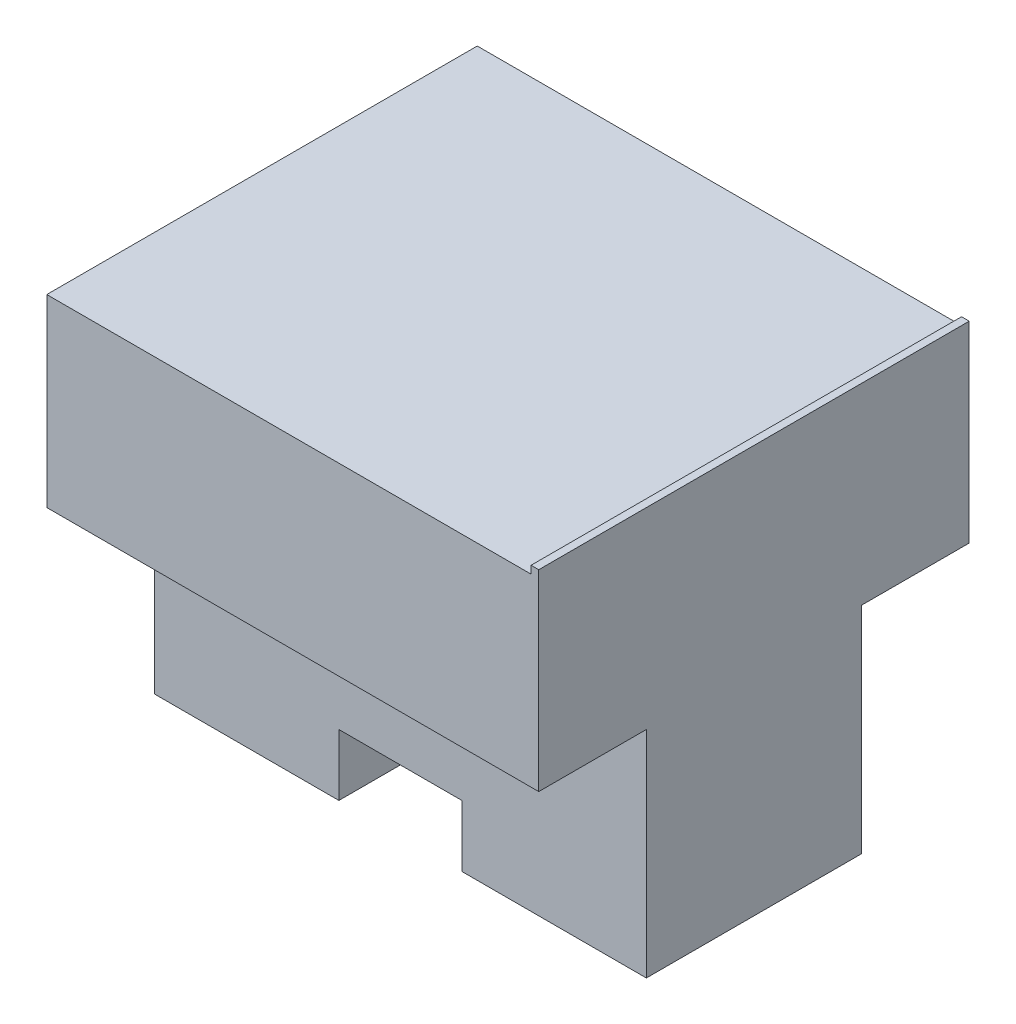
ISO-10303-21;
HEADER;
FILE_DESCRIPTION(('STEP AP214'),'2;1');
FILE_NAME('part.step','',(''),(''),'','','');
FILE_SCHEMA(('AUTOMOTIVE_DESIGN { 1 0 10303 214 1 1 1 1 }'));
ENDSEC;
DATA;
#1=APPLICATION_CONTEXT('core data for automotive mechanical design processes');
#2=APPLICATION_PROTOCOL_DEFINITION('international standard','automotive_design',2000,#1);
#3=PRODUCT_CONTEXT('',#1,'mechanical');
#4=PRODUCT('Part','Part','',(#3));
#5=PRODUCT_RELATED_PRODUCT_CATEGORY('part','',(#4));
#6=PRODUCT_DEFINITION_FORMATION('','',#4);
#7=PRODUCT_DEFINITION_CONTEXT('part definition',#1,'design');
#8=PRODUCT_DEFINITION('design','',#6,#7);
#9=PRODUCT_DEFINITION_SHAPE('','',#8);
#10=(LENGTH_UNIT() NAMED_UNIT(*) SI_UNIT(.MILLI.,.METRE.));
#11=(NAMED_UNIT(*) PLANE_ANGLE_UNIT() SI_UNIT($,.RADIAN.));
#12=(NAMED_UNIT(*) SI_UNIT($,.STERADIAN.) SOLID_ANGLE_UNIT());
#13=UNCERTAINTY_MEASURE_WITH_UNIT(LENGTH_MEASURE(1.E-05),#10,'distance_accuracy_value','');
#14=(GEOMETRIC_REPRESENTATION_CONTEXT(3) GLOBAL_UNCERTAINTY_ASSIGNED_CONTEXT((#13)) GLOBAL_UNIT_ASSIGNED_CONTEXT((#10,
#11,#12)) REPRESENTATION_CONTEXT('',''));
#15=CARTESIAN_POINT('',(0.,0.,0.));
#16=DIRECTION('',(0.,0.,1.));
#17=DIRECTION('',(1.,0.,0.));
#18=AXIS2_PLACEMENT_3D('',#15,#16,#17);
#19=CARTESIAN_POINT('',(-27.5,-69.9999999999932,0.));
#20=DIRECTION('',(0.,-1.,0.));
#21=DIRECTION('',(0.,0.,-1.));
#22=AXIS2_PLACEMENT_3D('',#19,#20,#21);
#23=CONICAL_SURFACE('',#22,2.45850000001383,1.04719755116584);
#24=CARTESIAN_POINT('',(-27.499999999975,-68.5805843631613,0.));
#25=VERTEX_POINT('',#24);
#26=VERTEX_LOOP('',#25);
#27=FACE_BOUND('',#26,.T.);
#28=CARTESIAN_POINT('',(-27.5,-70.,0.));
#29=DIRECTION('',(0.,-1.,0.));
#30=DIRECTION('',(0.,0.,-1.));
#31=AXIS2_PLACEMENT_3D('',#28,#29,#30);
#32=CIRCLE('',#31,2.4585);
#33=CARTESIAN_POINT('',(-27.5,-70.,-2.4585));
#34=VERTEX_POINT('',#33);
#35=EDGE_CURVE('E126',#34,#34,#32,.T.);
#36=ORIENTED_EDGE('',*,*,#35,.T.);
#37=EDGE_LOOP('',(#36));
#38=FACE_BOUND('',#37,.T.);
#39=ADVANCED_FACE('F17',(#27,#38),#23,.F.);
#40=CARTESIAN_POINT('',(-47.5,-69.9999999999932,0.));
#41=DIRECTION('',(0.,-1.,0.));
#42=DIRECTION('',(0.,0.,-1.));
#43=AXIS2_PLACEMENT_3D('',#40,#41,#42);
#44=CONICAL_SURFACE('',#43,2.45849999991833,1.0471975511322);
#45=CARTESIAN_POINT('',(-47.4999999999284,-68.5805843631897,0.));
#46=VERTEX_POINT('',#45);
#47=VERTEX_LOOP('',#46);
#48=FACE_BOUND('',#47,.T.);
#49=CARTESIAN_POINT('',(-47.5,-70.,0.));
#50=DIRECTION('',(0.,-1.,0.));
#51=DIRECTION('',(0.,0.,-1.));
#52=AXIS2_PLACEMENT_3D('',#49,#50,#51);
#53=CIRCLE('',#52,2.4585);
#54=CARTESIAN_POINT('',(-47.5,-70.,-2.4585));
#55=VERTEX_POINT('',#54);
#56=EDGE_CURVE('E128',#55,#55,#53,.T.);
#57=ORIENTED_EDGE('',*,*,#56,.T.);
#58=EDGE_LOOP('',(#57));
#59=FACE_BOUND('',#58,.T.);
#60=ADVANCED_FACE('F123',(#48,#59),#44,.F.);
#61=CARTESIAN_POINT('',(-27.5,-75.72925,0.));
#62=DIRECTION('',(0.,-1.,0.));
#63=DIRECTION('',(0.,0.,-1.));
#64=AXIS2_PLACEMENT_3D('',#61,#62,#63);
#65=CYLINDRICAL_SURFACE('',#64,2.4585);
#66=CARTESIAN_POINT('',(-27.5,-81.4585000000534,0.));
#67=DIRECTION('',(0.,-1.,0.));
#68=DIRECTION('',(1.,0.,0.));
#69=AXIS2_PLACEMENT_3D('',#66,#67,#68);
#70=CIRCLE('',#69,2.45850000001383);
#71=CARTESIAN_POINT('',(-25.0414999999862,-81.4585000000534,0.));
#72=VERTEX_POINT('',#71);
#73=EDGE_CURVE('E131',#72,#72,#70,.T.);
#74=ORIENTED_EDGE('',*,*,#73,.T.);
#75=EDGE_LOOP('',(#74));
#76=FACE_BOUND('',#75,.T.);
#77=ORIENTED_EDGE('',*,*,#35,.F.);
#78=EDGE_LOOP('',(#77));
#79=FACE_BOUND('',#78,.T.);
#80=ADVANCED_FACE('F175',(#76,#79),#65,.F.);
#81=CARTESIAN_POINT('',(-47.5,-75.72925,0.));
#82=DIRECTION('',(0.,-1.,0.));
#83=DIRECTION('',(0.,0.,-1.));
#84=AXIS2_PLACEMENT_3D('',#81,#82,#83);
#85=CYLINDRICAL_SURFACE('',#84,2.4585);
#86=CARTESIAN_POINT('',(-47.5,-81.4584999999966,0.));
#87=DIRECTION('',(0.,-1.,0.));
#88=DIRECTION('',(1.,0.,0.));
#89=AXIS2_PLACEMENT_3D('',#86,#87,#88);
#90=CIRCLE('',#89,2.45849999997517);
#91=CARTESIAN_POINT('',(-45.0415000000248,-81.4584999999966,0.));
#92=VERTEX_POINT('',#91);
#93=EDGE_CURVE('E170',#92,#92,#90,.T.);
#94=ORIENTED_EDGE('',*,*,#93,.T.);
#95=EDGE_LOOP('',(#94));
#96=FACE_BOUND('',#95,.T.);
#97=ORIENTED_EDGE('',*,*,#56,.F.);
#98=EDGE_LOOP('',(#97));
#99=FACE_BOUND('',#98,.T.);
#100=ADVANCED_FACE('F180',(#96,#99),#85,.F.);
#101=CARTESIAN_POINT('',(-27.5,-81.9999999999368,0.));
#102=DIRECTION('',(0.,-1.,0.));
#103=DIRECTION('',(0.,0.,-1.));
#104=AXIS2_PLACEMENT_3D('',#101,#102,#103);
#105=CONICAL_SURFACE('',#104,2.99999999989722,0.785398163397448);
#106=CARTESIAN_POINT('',(-27.5,-81.9999999999936,0.));
#107=DIRECTION('',(0.,-1.,0.));
#108=DIRECTION('',(0.,0.,-1.));
#109=AXIS2_PLACEMENT_3D('',#106,#107,#108);
#110=CIRCLE('',#109,2.99999999995407);
#111=CARTESIAN_POINT('',(-27.5,-81.9999999999936,-2.99999999995407));
#112=VERTEX_POINT('',#111);
#113=EDGE_CURVE('E20',#112,#112,#110,.F.);
#114=ORIENTED_EDGE('',*,*,#113,.F.);
#115=EDGE_LOOP('',(#114));
#116=FACE_BOUND('',#115,.T.);
#117=ORIENTED_EDGE('',*,*,#73,.F.);
#118=EDGE_LOOP('',(#117));
#119=FACE_BOUND('',#118,.T.);
#120=ADVANCED_FACE('F177',(#116,#119),#105,.F.);
#121=CARTESIAN_POINT('',(-47.5,-81.99999999988,0.));
#122=DIRECTION('',(0.,-1.,0.));
#123=DIRECTION('',(0.,0.,-1.));
#124=AXIS2_PLACEMENT_3D('',#121,#122,#123);
#125=CONICAL_SURFACE('',#124,2.99999999985857,0.785398163397448);
#126=CARTESIAN_POINT('',(-47.5,-81.9999999999936,0.));
#127=DIRECTION('',(0.,-1.,0.));
#128=DIRECTION('',(0.,0.,-1.));
#129=AXIS2_PLACEMENT_3D('',#126,#127,#128);
#130=CIRCLE('',#129,2.99999999997226);
#131=CARTESIAN_POINT('',(-47.5,-81.9999999999936,-2.99999999997226));
#132=VERTEX_POINT('',#131);
#133=EDGE_CURVE('E134',#132,#132,#130,.F.);
#134=ORIENTED_EDGE('',*,*,#133,.F.);
#135=EDGE_LOOP('',(#134));
#136=FACE_BOUND('',#135,.T.);
#137=ORIENTED_EDGE('',*,*,#93,.F.);
#138=EDGE_LOOP('',(#137));
#139=FACE_BOUND('',#138,.T.);
#140=ADVANCED_FACE('F179',(#136,#139),#125,.F.);
#141=CARTESIAN_POINT('',(-41.5,-82.,7.));
#142=DIRECTION('',(-1.,0.,0.));
#143=DIRECTION('',(0.,0.,1.));
#144=AXIS2_PLACEMENT_3D('',#141,#142,#143);
#145=PLANE('',#144);
#146=DIRECTION('',(0.,-1.,0.));
#147=VECTOR('',#146,1.);
#148=CARTESIAN_POINT('',(-41.5,-68.,7.));
#149=LINE('',#148,#147);
#150=CARTESIAN_POINT('',(-41.5,-82.,7.));
#151=VERTEX_POINT('',#150);
#152=CARTESIAN_POINT('',(-41.5,-78.,7.));
#153=VERTEX_POINT('',#152);
#154=EDGE_CURVE('E156',#151,#153,#149,.F.);
#155=ORIENTED_EDGE('',*,*,#154,.F.);
#156=DIRECTION('',(0.,0.,-1.));
#157=VECTOR('',#156,1.);
#158=CARTESIAN_POINT('',(-41.5,-82.,7.));
#159=LINE('',#158,#157);
#160=CARTESIAN_POINT('',(-41.5,-82.,-7.));
#161=VERTEX_POINT('',#160);
#162=EDGE_CURVE('E136',#161,#151,#159,.F.);
#163=ORIENTED_EDGE('',*,*,#162,.F.);
#164=DIRECTION('',(0.,1.,0.));
#165=VECTOR('',#164,1.);
#166=CARTESIAN_POINT('',(-41.5,-82.,-7.));
#167=LINE('',#166,#165);
#168=CARTESIAN_POINT('',(-41.5,-78.,-7.));
#169=VERTEX_POINT('',#168);
#170=EDGE_CURVE('E270',#169,#161,#167,.F.);
#171=ORIENTED_EDGE('',*,*,#170,.F.);
#172=DIRECTION('',(0.,0.,-1.));
#173=VECTOR('',#172,1.);
#174=CARTESIAN_POINT('',(-41.5,-78.,-7.));
#175=LINE('',#174,#173);
#176=EDGE_CURVE('E165',#153,#169,#175,.T.);
#177=ORIENTED_EDGE('',*,*,#176,.F.);
#178=EDGE_LOOP('',(#155,#163,#171,#177));
#179=FACE_BOUND('',#178,.T.);
#180=ADVANCED_FACE('F189',(#179),#145,.F.);
#181=CARTESIAN_POINT('',(-33.5,-82.,-7.));
#182=DIRECTION('',(1.,0.,0.));
#183=DIRECTION('',(0.,0.,-1.));
#184=AXIS2_PLACEMENT_3D('',#181,#182,#183);
#185=PLANE('',#184);
#186=DIRECTION('',(0.,1.,0.));
#187=VECTOR('',#186,1.);
#188=CARTESIAN_POINT('',(-33.5,-82.,-7.));
#189=LINE('',#188,#187);
#190=CARTESIAN_POINT('',(-33.5,-82.,-7.));
#191=VERTEX_POINT('',#190);
#192=CARTESIAN_POINT('',(-33.5,-78.,-7.));
#193=VERTEX_POINT('',#192);
#194=EDGE_CURVE('E286',#191,#193,#189,.T.);
#195=ORIENTED_EDGE('',*,*,#194,.F.);
#196=DIRECTION('',(0.,0.,-1.));
#197=VECTOR('',#196,1.);
#198=CARTESIAN_POINT('',(-33.5,-82.,7.));
#199=LINE('',#198,#197);
#200=CARTESIAN_POINT('',(-33.5,-82.,7.));
#201=VERTEX_POINT('',#200);
#202=EDGE_CURVE('E163',#201,#191,#199,.T.);
#203=ORIENTED_EDGE('',*,*,#202,.F.);
#204=DIRECTION('',(0.,-1.,0.));
#205=VECTOR('',#204,1.);
#206=CARTESIAN_POINT('',(-33.5,-68.,7.));
#207=LINE('',#206,#205);
#208=CARTESIAN_POINT('',(-33.5,-78.,7.));
#209=VERTEX_POINT('',#208);
#210=EDGE_CURVE('E143',#209,#201,#207,.T.);
#211=ORIENTED_EDGE('',*,*,#210,.F.);
#212=DIRECTION('',(0.,0.,-1.));
#213=VECTOR('',#212,1.);
#214=CARTESIAN_POINT('',(-33.5,-78.,-7.));
#215=LINE('',#214,#213);
#216=EDGE_CURVE('E168',#193,#209,#215,.F.);
#217=ORIENTED_EDGE('',*,*,#216,.F.);
#218=EDGE_LOOP('',(#195,#203,#211,#217));
#219=FACE_BOUND('',#218,.T.);
#220=ADVANCED_FACE('F253',(#219),#185,.F.);
#221=CARTESIAN_POINT('',(-53.5,-78.,-7.));
#222=DIRECTION('',(0.,-1.,0.));
#223=DIRECTION('',(0.,0.,-1.));
#224=AXIS2_PLACEMENT_3D('',#221,#222,#223);
#225=PLANE('',#224);
#226=ORIENTED_EDGE('',*,*,#176,.T.);
#227=DIRECTION('',(1.,0.,0.));
#228=VECTOR('',#227,1.);
#229=CARTESIAN_POINT('',(-21.5,-78.,-7.));
#230=LINE('',#229,#228);
#231=EDGE_CURVE('E281',#193,#169,#230,.F.);
#232=ORIENTED_EDGE('',*,*,#231,.F.);
#233=ORIENTED_EDGE('',*,*,#216,.T.);
#234=DIRECTION('',(1.,0.,0.));
#235=VECTOR('',#234,1.);
#236=CARTESIAN_POINT('',(-21.5,-78.,7.));
#237=LINE('',#236,#235);
#238=EDGE_CURVE('E150',#153,#209,#237,.T.);
#239=ORIENTED_EDGE('',*,*,#238,.F.);
#240=EDGE_LOOP('',(#226,#232,#233,#239));
#241=FACE_BOUND('',#240,.T.);
#242=ADVANCED_FACE('F249',(#241),#225,.T.);
#243=CARTESIAN_POINT('',(-21.5,-82.,7.));
#244=DIRECTION('',(0.,-1.,0.));
#245=DIRECTION('',(0.,0.,-1.));
#246=AXIS2_PLACEMENT_3D('',#243,#244,#245);
#247=PLANE('',#246);
#248=DIRECTION('',(0.,0.,-1.));
#249=VECTOR('',#248,1.);
#250=CARTESIAN_POINT('',(-21.5,-82.,0.));
#251=LINE('',#250,#249);
#252=CARTESIAN_POINT('',(-21.5,-82.,7.));
#253=VERTEX_POINT('',#252);
#254=CARTESIAN_POINT('',(-21.5,-82.,-7.));
#255=VERTEX_POINT('',#254);
#256=EDGE_CURVE('E300',#253,#255,#251,.T.);
#257=ORIENTED_EDGE('',*,*,#256,.F.);
#258=DIRECTION('',(1.,0.,0.));
#259=VECTOR('',#258,1.);
#260=CARTESIAN_POINT('',(-21.5,-82.,7.));
#261=LINE('',#260,#259);
#262=EDGE_CURVE('E137',#201,#253,#261,.T.);
#263=ORIENTED_EDGE('',*,*,#262,.F.);
#264=ORIENTED_EDGE('',*,*,#202,.T.);
#265=DIRECTION('',(1.,0.,0.));
#266=VECTOR('',#265,1.);
#267=CARTESIAN_POINT('',(-21.5,-82.,-7.));
#268=LINE('',#267,#266);
#269=EDGE_CURVE('E276',#255,#191,#268,.F.);
#270=ORIENTED_EDGE('',*,*,#269,.F.);
#271=EDGE_LOOP('',(#257,#263,#264,#270));
#272=FACE_BOUND('',#271,.T.);
#273=ORIENTED_EDGE('',*,*,#113,.T.);
#274=EDGE_LOOP('',(#273));
#275=FACE_BOUND('',#274,.T.);
#276=ADVANCED_FACE('F245',(#272,#275),#247,.T.);
#277=CARTESIAN_POINT('',(-21.5,-55.5,-14.));
#278=DIRECTION('',(0.,1.,0.));
#279=DIRECTION('',(0.,0.,1.));
#280=AXIS2_PLACEMENT_3D('',#277,#278,#279);
#281=PLANE('',#280);
#282=DIRECTION('',(0.,0.,-1.));
#283=VECTOR('',#282,1.);
#284=CARTESIAN_POINT('',(-21.5,-55.5,0.));
#285=LINE('',#284,#283);
#286=CARTESIAN_POINT('',(-21.5,-55.5,-14.));
#287=VERTEX_POINT('',#286);
#288=CARTESIAN_POINT('',(-21.5,-55.5,14.));
#289=VERTEX_POINT('',#288);
#290=EDGE_CURVE('E308',#287,#289,#285,.F.);
#291=ORIENTED_EDGE('',*,*,#290,.F.);
#292=DIRECTION('',(1.,0.,0.));
#293=VECTOR('',#292,1.);
#294=CARTESIAN_POINT('',(-21.5,-55.5,-14.));
#295=LINE('',#294,#293);
#296=CARTESIAN_POINT('',(-22.,-55.5,-14.));
#297=VERTEX_POINT('',#296);
#298=EDGE_CURVE('E159',#287,#297,#295,.F.);
#299=ORIENTED_EDGE('',*,*,#298,.T.);
#300=DIRECTION('',(0.,0.,-1.));
#301=VECTOR('',#300,1.);
#302=CARTESIAN_POINT('',(-22.,-55.5,0.));
#303=LINE('',#302,#301);
#304=CARTESIAN_POINT('',(-22.,-55.5,14.));
#305=VERTEX_POINT('',#304);
#306=EDGE_CURVE('E311',#297,#305,#303,.F.);
#307=ORIENTED_EDGE('',*,*,#306,.T.);
#308=DIRECTION('',(1.,0.,0.));
#309=VECTOR('',#308,1.);
#310=CARTESIAN_POINT('',(-21.5,-55.5,14.));
#311=LINE('',#310,#309);
#312=EDGE_CURVE('E161',#305,#289,#311,.T.);
#313=ORIENTED_EDGE('',*,*,#312,.T.);
#314=EDGE_LOOP('',(#291,#299,#307,#313));
#315=FACE_BOUND('',#314,.T.);
#316=ADVANCED_FACE('F242',(#315),#281,.T.);
#317=CARTESIAN_POINT('',(-21.5,-68.,7.));
#318=DIRECTION('',(0.,0.,1.));
#319=DIRECTION('',(0.,-1.,0.));
#320=AXIS2_PLACEMENT_3D('',#317,#318,#319);
#321=PLANE('',#320);
#322=DIRECTION('',(0.,1.,0.));
#323=VECTOR('',#322,1.);
#324=CARTESIAN_POINT('',(-53.5,-56.,7.));
#325=LINE('',#324,#323);
#326=CARTESIAN_POINT('',(-53.5,-68.,7.));
#327=VERTEX_POINT('',#326);
#328=CARTESIAN_POINT('',(-53.5,-82.,7.));
#329=VERTEX_POINT('',#328);
#330=EDGE_CURVE('E268',#327,#329,#325,.F.);
#331=ORIENTED_EDGE('',*,*,#330,.T.);
#332=DIRECTION('',(1.,0.,0.));
#333=VECTOR('',#332,1.);
#334=CARTESIAN_POINT('',(-21.5,-82.,7.));
#335=LINE('',#334,#333);
#336=EDGE_CURVE('E141',#151,#329,#335,.F.);
#337=ORIENTED_EDGE('',*,*,#336,.F.);
#338=ORIENTED_EDGE('',*,*,#154,.T.);
#339=ORIENTED_EDGE('',*,*,#238,.T.);
#340=ORIENTED_EDGE('',*,*,#210,.T.);
#341=ORIENTED_EDGE('',*,*,#262,.T.);
#342=DIRECTION('',(0.,1.,0.));
#343=VECTOR('',#342,1.);
#344=CARTESIAN_POINT('',(-21.5,-56.,7.));
#345=LINE('',#344,#343);
#346=CARTESIAN_POINT('',(-21.5,-68.,7.));
#347=VERTEX_POINT('',#346);
#348=EDGE_CURVE('E297',#347,#253,#345,.F.);
#349=ORIENTED_EDGE('',*,*,#348,.F.);
#350=DIRECTION('',(1.,0.,0.));
#351=VECTOR('',#350,1.);
#352=CARTESIAN_POINT('',(-21.5,-68.,7.));
#353=LINE('',#352,#351);
#354=EDGE_CURVE('E292',#327,#347,#353,.T.);
#355=ORIENTED_EDGE('',*,*,#354,.F.);
#356=EDGE_LOOP('',(#331,#337,#338,#339,#340,#341,#349,#355));
#357=FACE_BOUND('',#356,.T.);
#358=ADVANCED_FACE('F238',(#357),#321,.T.);
#359=CARTESIAN_POINT('',(-21.5,-82.,7.));
#360=DIRECTION('',(0.,-1.,0.));
#361=DIRECTION('',(0.,0.,-1.));
#362=AXIS2_PLACEMENT_3D('',#359,#360,#361);
#363=PLANE('',#362);
#364=DIRECTION('',(0.,0.,-1.));
#365=VECTOR('',#364,1.);
#366=CARTESIAN_POINT('',(-53.5,-82.,0.));
#367=LINE('',#366,#365);
#368=CARTESIAN_POINT('',(-53.5,-82.,-7.));
#369=VERTEX_POINT('',#368);
#370=EDGE_CURVE('E274',#329,#369,#367,.T.);
#371=ORIENTED_EDGE('',*,*,#370,.T.);
#372=DIRECTION('',(1.,0.,0.));
#373=VECTOR('',#372,1.);
#374=CARTESIAN_POINT('',(-21.5,-82.,-7.));
#375=LINE('',#374,#373);
#376=EDGE_CURVE('E272',#161,#369,#375,.F.);
#377=ORIENTED_EDGE('',*,*,#376,.F.);
#378=ORIENTED_EDGE('',*,*,#162,.T.);
#379=ORIENTED_EDGE('',*,*,#336,.T.);
#380=EDGE_LOOP('',(#371,#377,#378,#379));
#381=FACE_BOUND('',#380,.T.);
#382=ORIENTED_EDGE('',*,*,#133,.T.);
#383=EDGE_LOOP('',(#382));
#384=FACE_BOUND('',#383,.T.);
#385=ADVANCED_FACE('F234',(#381,#384),#363,.T.);
#386=CARTESIAN_POINT('',(-21.5,-82.,-7.));
#387=DIRECTION('',(0.,0.,-1.));
#388=DIRECTION('',(0.,1.,0.));
#389=AXIS2_PLACEMENT_3D('',#386,#387,#388);
#390=PLANE('',#389);
#391=ORIENTED_EDGE('',*,*,#194,.T.);
#392=ORIENTED_EDGE('',*,*,#231,.T.);
#393=ORIENTED_EDGE('',*,*,#170,.T.);
#394=ORIENTED_EDGE('',*,*,#376,.T.);
#395=DIRECTION('',(0.,1.,0.));
#396=VECTOR('',#395,1.);
#397=CARTESIAN_POINT('',(-53.5,-56.,-7.));
#398=LINE('',#397,#396);
#399=CARTESIAN_POINT('',(-53.5,-68.,-7.));
#400=VERTEX_POINT('',#399);
#401=EDGE_CURVE('E325',#369,#400,#398,.T.);
#402=ORIENTED_EDGE('',*,*,#401,.T.);
#403=DIRECTION('',(1.,0.,0.));
#404=VECTOR('',#403,1.);
#405=CARTESIAN_POINT('',(-21.5,-68.,-7.));
#406=LINE('',#405,#404);
#407=CARTESIAN_POINT('',(-21.5,-68.,-7.));
#408=VERTEX_POINT('',#407);
#409=EDGE_CURVE('E289',#408,#400,#406,.F.);
#410=ORIENTED_EDGE('',*,*,#409,.F.);
#411=DIRECTION('',(0.,1.,0.));
#412=VECTOR('',#411,1.);
#413=CARTESIAN_POINT('',(-21.5,-56.,-7.));
#414=LINE('',#413,#412);
#415=EDGE_CURVE('E303',#255,#408,#414,.T.);
#416=ORIENTED_EDGE('',*,*,#415,.F.);
#417=ORIENTED_EDGE('',*,*,#269,.T.);
#418=EDGE_LOOP('',(#391,#392,#393,#394,#402,#410,#416,#417));
#419=FACE_BOUND('',#418,.T.);
#420=ADVANCED_FACE('F230',(#419),#390,.T.);
#421=CARTESIAN_POINT('',(-21.5,-68.,-7.));
#422=DIRECTION('',(0.,-1.,0.));
#423=DIRECTION('',(0.,0.,-1.));
#424=AXIS2_PLACEMENT_3D('',#421,#422,#423);
#425=PLANE('',#424);
#426=DIRECTION('',(0.,0.,-1.));
#427=VECTOR('',#426,1.);
#428=CARTESIAN_POINT('',(-21.5,-68.,0.));
#429=LINE('',#428,#427);
#430=CARTESIAN_POINT('',(-21.5,-68.,-14.));
#431=VERTEX_POINT('',#430);
#432=EDGE_CURVE('E306',#408,#431,#429,.T.);
#433=ORIENTED_EDGE('',*,*,#432,.F.);
#434=ORIENTED_EDGE('',*,*,#409,.T.);
#435=DIRECTION('',(0.,0.,-1.));
#436=VECTOR('',#435,1.);
#437=CARTESIAN_POINT('',(-53.5,-68.,0.));
#438=LINE('',#437,#436);
#439=CARTESIAN_POINT('',(-53.5,-68.,-14.));
#440=VERTEX_POINT('',#439);
#441=EDGE_CURVE('E327',#400,#440,#438,.T.);
#442=ORIENTED_EDGE('',*,*,#441,.T.);
#443=DIRECTION('',(-1.,0.,0.));
#444=VECTOR('',#443,1.);
#445=CARTESIAN_POINT('',(-21.5,-68.,-14.));
#446=LINE('',#445,#444);
#447=EDGE_CURVE('E320',#431,#440,#446,.T.);
#448=ORIENTED_EDGE('',*,*,#447,.F.);
#449=EDGE_LOOP('',(#433,#434,#442,#448));
#450=FACE_BOUND('',#449,.T.);
#451=ADVANCED_FACE('F226',(#450),#425,.T.);
#452=CARTESIAN_POINT('',(-21.5,-68.,14.));
#453=DIRECTION('',(0.,-1.,0.));
#454=DIRECTION('',(0.,0.,-1.));
#455=AXIS2_PLACEMENT_3D('',#452,#453,#454);
#456=PLANE('',#455);
#457=DIRECTION('',(0.,0.,-1.));
#458=VECTOR('',#457,1.);
#459=CARTESIAN_POINT('',(-21.5,-68.,0.));
#460=LINE('',#459,#458);
#461=CARTESIAN_POINT('',(-21.5,-68.,14.));
#462=VERTEX_POINT('',#461);
#463=EDGE_CURVE('E294',#462,#347,#460,.T.);
#464=ORIENTED_EDGE('',*,*,#463,.F.);
#465=DIRECTION('',(1.,0.,0.));
#466=VECTOR('',#465,1.);
#467=CARTESIAN_POINT('',(-21.5,-68.,14.));
#468=LINE('',#467,#466);
#469=CARTESIAN_POINT('',(-53.5,-68.,14.));
#470=VERTEX_POINT('',#469);
#471=EDGE_CURVE('E335',#470,#462,#468,.T.);
#472=ORIENTED_EDGE('',*,*,#471,.F.);
#473=DIRECTION('',(0.,0.,-1.));
#474=VECTOR('',#473,1.);
#475=CARTESIAN_POINT('',(-53.5,-68.,0.));
#476=LINE('',#475,#474);
#477=EDGE_CURVE('E331',#470,#327,#476,.T.);
#478=ORIENTED_EDGE('',*,*,#477,.T.);
#479=ORIENTED_EDGE('',*,*,#354,.T.);
#480=EDGE_LOOP('',(#464,#472,#478,#479));
#481=FACE_BOUND('',#480,.T.);
#482=ADVANCED_FACE('F222',(#481),#456,.T.);
#483=CARTESIAN_POINT('',(-21.5,-56.,0.));
#484=DIRECTION('',(1.,0.,0.));
#485=DIRECTION('',(0.,0.,-1.));
#486=AXIS2_PLACEMENT_3D('',#483,#484,#485);
#487=PLANE('',#486);
#488=DIRECTION('',(0.,1.,0.));
#489=VECTOR('',#488,1.);
#490=CARTESIAN_POINT('',(-21.5,-68.,-14.));
#491=LINE('',#490,#489);
#492=EDGE_CURVE('E317',#287,#431,#491,.F.);
#493=ORIENTED_EDGE('',*,*,#492,.F.);
#494=ORIENTED_EDGE('',*,*,#290,.T.);
#495=DIRECTION('',(0.,1.,0.));
#496=VECTOR('',#495,1.);
#497=CARTESIAN_POINT('',(-21.5,-56.,14.));
#498=LINE('',#497,#496);
#499=EDGE_CURVE('E338',#462,#289,#498,.T.);
#500=ORIENTED_EDGE('',*,*,#499,.F.);
#501=ORIENTED_EDGE('',*,*,#463,.T.);
#502=ORIENTED_EDGE('',*,*,#348,.T.);
#503=ORIENTED_EDGE('',*,*,#256,.T.);
#504=ORIENTED_EDGE('',*,*,#415,.T.);
#505=ORIENTED_EDGE('',*,*,#432,.T.);
#506=EDGE_LOOP('',(#493,#494,#500,#501,#502,#503,#504,#505));
#507=FACE_BOUND('',#506,.T.);
#508=ADVANCED_FACE('F218',(#507),#487,.T.);
#509=CARTESIAN_POINT('',(-22.,-56.,0.));
#510=DIRECTION('',(1.,0.,0.));
#511=DIRECTION('',(0.,0.,-1.));
#512=AXIS2_PLACEMENT_3D('',#509,#510,#511);
#513=PLANE('',#512);
#514=DIRECTION('',(0.,0.,1.));
#515=VECTOR('',#514,1.);
#516=CARTESIAN_POINT('',(-22.,-56.,-14.));
#517=LINE('',#516,#515);
#518=CARTESIAN_POINT('',(-22.,-56.,14.));
#519=VERTEX_POINT('',#518);
#520=CARTESIAN_POINT('',(-22.,-56.,-14.));
#521=VERTEX_POINT('',#520);
#522=EDGE_CURVE('E344',#519,#521,#517,.F.);
#523=ORIENTED_EDGE('',*,*,#522,.F.);
#524=DIRECTION('',(0.,1.,0.));
#525=VECTOR('',#524,1.);
#526=CARTESIAN_POINT('',(-22.,-56.,14.));
#527=LINE('',#526,#525);
#528=EDGE_CURVE('E341',#305,#519,#527,.F.);
#529=ORIENTED_EDGE('',*,*,#528,.F.);
#530=ORIENTED_EDGE('',*,*,#306,.F.);
#531=DIRECTION('',(0.,1.,0.));
#532=VECTOR('',#531,1.);
#533=CARTESIAN_POINT('',(-22.,-68.,-14.));
#534=LINE('',#533,#532);
#535=EDGE_CURVE('E314',#521,#297,#534,.T.);
#536=ORIENTED_EDGE('',*,*,#535,.F.);
#537=EDGE_LOOP('',(#523,#529,#530,#536));
#538=FACE_BOUND('',#537,.T.);
#539=ADVANCED_FACE('F214',(#538),#513,.F.);
#540=CARTESIAN_POINT('',(-21.5,-68.,-14.));
#541=DIRECTION('',(0.,0.,-1.));
#542=DIRECTION('',(-1.,0.,0.));
#543=AXIS2_PLACEMENT_3D('',#540,#541,#542);
#544=PLANE('',#543);
#545=ORIENTED_EDGE('',*,*,#492,.T.);
#546=ORIENTED_EDGE('',*,*,#447,.T.);
#547=DIRECTION('',(0.,1.,0.));
#548=VECTOR('',#547,1.);
#549=CARTESIAN_POINT('',(-53.5,-56.,-14.));
#550=LINE('',#549,#548);
#551=CARTESIAN_POINT('',(-53.5,-56.,-14.));
#552=VERTEX_POINT('',#551);
#553=EDGE_CURVE('E329',#440,#552,#550,.T.);
#554=ORIENTED_EDGE('',*,*,#553,.T.);
#555=DIRECTION('',(1.,0.,0.));
#556=VECTOR('',#555,1.);
#557=CARTESIAN_POINT('',(-21.5,-56.,-14.));
#558=LINE('',#557,#556);
#559=EDGE_CURVE('E347',#521,#552,#558,.F.);
#560=ORIENTED_EDGE('',*,*,#559,.F.);
#561=ORIENTED_EDGE('',*,*,#535,.T.);
#562=ORIENTED_EDGE('',*,*,#298,.F.);
#563=EDGE_LOOP('',(#545,#546,#554,#560,#561,#562));
#564=FACE_BOUND('',#563,.T.);
#565=ADVANCED_FACE('F211',(#564),#544,.T.);
#566=CARTESIAN_POINT('',(-53.5,-56.,0.));
#567=DIRECTION('',(1.,0.,0.));
#568=DIRECTION('',(0.,0.,-1.));
#569=AXIS2_PLACEMENT_3D('',#566,#567,#568);
#570=PLANE('',#569);
#571=DIRECTION('',(0.,1.,0.));
#572=VECTOR('',#571,1.);
#573=CARTESIAN_POINT('',(-53.5,-56.,14.));
#574=LINE('',#573,#572);
#575=CARTESIAN_POINT('',(-53.5,-56.,14.));
#576=VERTEX_POINT('',#575);
#577=EDGE_CURVE('E35',#576,#470,#574,.F.);
#578=ORIENTED_EDGE('',*,*,#577,.F.);
#579=DIRECTION('',(0.,0.,1.));
#580=VECTOR('',#579,1.);
#581=CARTESIAN_POINT('',(-53.5,-56.,-14.));
#582=LINE('',#581,#580);
#583=EDGE_CURVE('E26',#552,#576,#582,.T.);
#584=ORIENTED_EDGE('',*,*,#583,.F.);
#585=ORIENTED_EDGE('',*,*,#553,.F.);
#586=ORIENTED_EDGE('',*,*,#441,.F.);
#587=ORIENTED_EDGE('',*,*,#401,.F.);
#588=ORIENTED_EDGE('',*,*,#370,.F.);
#589=ORIENTED_EDGE('',*,*,#330,.F.);
#590=ORIENTED_EDGE('',*,*,#477,.F.);
#591=EDGE_LOOP('',(#578,#584,#585,#586,#587,#588,#589,#590));
#592=FACE_BOUND('',#591,.T.);
#593=ADVANCED_FACE('F204',(#592),#570,.F.);
#594=CARTESIAN_POINT('',(-21.5,-56.,14.));
#595=DIRECTION('',(0.,0.,1.));
#596=DIRECTION('',(1.,0.,0.));
#597=AXIS2_PLACEMENT_3D('',#594,#595,#596);
#598=PLANE('',#597);
#599=ORIENTED_EDGE('',*,*,#528,.T.);
#600=DIRECTION('',(1.,0.,0.));
#601=VECTOR('',#600,1.);
#602=CARTESIAN_POINT('',(-21.5,-56.,14.));
#603=LINE('',#602,#601);
#604=EDGE_CURVE('E11',#576,#519,#603,.T.);
#605=ORIENTED_EDGE('',*,*,#604,.F.);
#606=ORIENTED_EDGE('',*,*,#577,.T.);
#607=ORIENTED_EDGE('',*,*,#471,.T.);
#608=ORIENTED_EDGE('',*,*,#499,.T.);
#609=ORIENTED_EDGE('',*,*,#312,.F.);
#610=EDGE_LOOP('',(#599,#605,#606,#607,#608,#609));
#611=FACE_BOUND('',#610,.T.);
#612=ADVANCED_FACE('F197',(#611),#598,.T.);
#613=CARTESIAN_POINT('',(-21.5,-56.,-14.));
#614=DIRECTION('',(0.,1.,0.));
#615=DIRECTION('',(0.,0.,1.));
#616=AXIS2_PLACEMENT_3D('',#613,#614,#615);
#617=PLANE('',#616);
#618=ORIENTED_EDGE('',*,*,#583,.T.);
#619=ORIENTED_EDGE('',*,*,#604,.T.);
#620=ORIENTED_EDGE('',*,*,#522,.T.);
#621=ORIENTED_EDGE('',*,*,#559,.T.);
#622=EDGE_LOOP('',(#618,#619,#620,#621));
#623=FACE_BOUND('',#622,.T.);
#624=ADVANCED_FACE('F195',(#623),#617,.T.);
#625=CLOSED_SHELL('',(#39,#60,#80,#100,#120,#140,#180,#220,#242,#276,#316,#358,#385,#420,#451,
#482,#508,#539,#565,#593,#612,#624));
#626=MANIFOLD_SOLID_BREP('B1',#625);
#627=ADVANCED_BREP_SHAPE_REPRESENTATION('',(#18,#626),#14);
#628=SHAPE_DEFINITION_REPRESENTATION(#9,#627);
ENDSEC;
END-ISO-10303-21;
